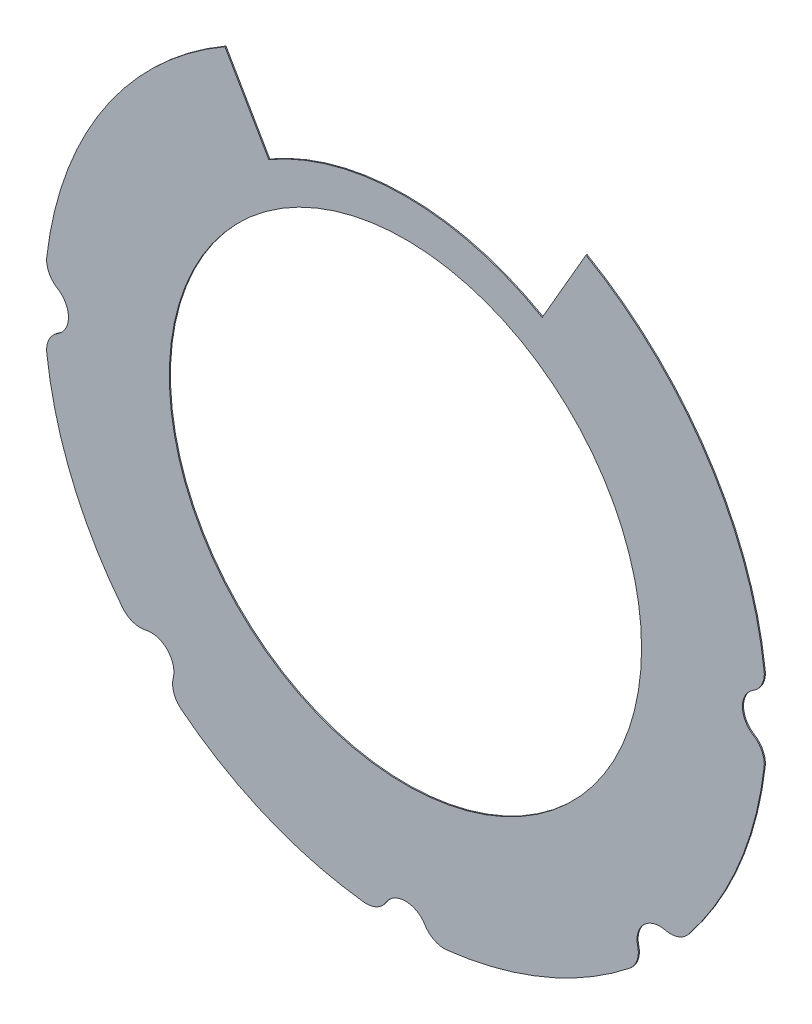
ISO-10303-21;
HEADER;
FILE_DESCRIPTION(('STEP AP214'),'2;1');
FILE_NAME('part.step','',(''),(''),'','','');
FILE_SCHEMA(('AUTOMOTIVE_DESIGN { 1 0 10303 214 1 1 1 1 }'));
ENDSEC;
DATA;
#1=APPLICATION_CONTEXT('core data for automotive mechanical design processes');
#2=APPLICATION_PROTOCOL_DEFINITION('international standard','automotive_design',2000,#1);
#3=PRODUCT_CONTEXT('',#1,'mechanical');
#4=PRODUCT('Part','Part','',(#3));
#5=PRODUCT_RELATED_PRODUCT_CATEGORY('part','',(#4));
#6=PRODUCT_DEFINITION_FORMATION('','',#4);
#7=PRODUCT_DEFINITION_CONTEXT('part definition',#1,'design');
#8=PRODUCT_DEFINITION('design','',#6,#7);
#9=PRODUCT_DEFINITION_SHAPE('','',#8);
#10=(LENGTH_UNIT() NAMED_UNIT(*) SI_UNIT(.MILLI.,.METRE.));
#11=(NAMED_UNIT(*) PLANE_ANGLE_UNIT() SI_UNIT($,.RADIAN.));
#12=(NAMED_UNIT(*) SI_UNIT($,.STERADIAN.) SOLID_ANGLE_UNIT());
#13=UNCERTAINTY_MEASURE_WITH_UNIT(LENGTH_MEASURE(1.E-05),#10,'distance_accuracy_value','');
#14=(GEOMETRIC_REPRESENTATION_CONTEXT(3) GLOBAL_UNCERTAINTY_ASSIGNED_CONTEXT((#13)) GLOBAL_UNIT_ASSIGNED_CONTEXT((#10,
#11,#12)) REPRESENTATION_CONTEXT('',''));
#15=CARTESIAN_POINT('',(0.,0.,0.));
#16=DIRECTION('',(0.,0.,1.));
#17=DIRECTION('',(1.,0.,0.));
#18=AXIS2_PLACEMENT_3D('',#15,#16,#17);
#19=CARTESIAN_POINT('',(-46.6814400000016,5.41970336147584,-15.88));
#20=DIRECTION('',(0.,0.,1.));
#21=DIRECTION('',(1.,0.,0.));
#22=AXIS2_PLACEMENT_3D('',#19,#20,#21);
#23=CYLINDRICAL_SURFACE('',#22,3.17999999998999);
#24=CARTESIAN_POINT('',(-46.6814400000016,5.41970336147584,-15.88));
#25=DIRECTION('',(0.,0.,1.));
#26=DIRECTION('',(1.,0.,0.));
#27=AXIS2_PLACEMENT_3D('',#24,#25,#26);
#28=CIRCLE('',#27,3.17999999998999);
#29=CARTESIAN_POINT('',(-49.8402224066298,5.7864371988932,-15.88));
#30=VERTEX_POINT('',#29);
#31=CARTESIAN_POINT('',(-48.3420254916252,2.70771961797535,-15.88));
#32=VERTEX_POINT('',#31);
#33=EDGE_CURVE('E20',#30,#32,#28,.T.);
#34=ORIENTED_EDGE('',*,*,#33,.T.);
#35=DIRECTION('',(0.,0.,-1.));
#36=VECTOR('',#35,1.);
#37=CARTESIAN_POINT('',(-48.3420254915091,2.70771961790426,-15.8050000000003));
#38=LINE('',#37,#36);
#39=CARTESIAN_POINT('',(-48.3420254916225,2.70771961797972,-15.7300000000006));
#40=VERTEX_POINT('',#39);
#41=EDGE_CURVE('E157',#32,#40,#38,.F.);
#42=ORIENTED_EDGE('',*,*,#41,.T.);
#43=CARTESIAN_POINT('',(-46.6814400000016,5.41970336147584,-15.7300000000006));
#44=DIRECTION('',(0.,0.,1.));
#45=DIRECTION('',(1.,0.,0.));
#46=AXIS2_PLACEMENT_3D('',#43,#44,#45);
#47=CIRCLE('',#46,3.17999999998999);
#48=CARTESIAN_POINT('',(-49.840222406629,5.7864371988931,-15.7300000000006));
#49=VERTEX_POINT('',#48);
#50=EDGE_CURVE('E284',#40,#49,#47,.F.);
#51=ORIENTED_EDGE('',*,*,#50,.T.);
#52=DIRECTION('',(0.,0.,-1.));
#53=VECTOR('',#52,1.);
#54=CARTESIAN_POINT('',(-49.840222406629,5.78643719889299,-15.8050000000003));
#55=LINE('',#54,#53);
#56=EDGE_CURVE('E166',#49,#30,#55,.T.);
#57=ORIENTED_EDGE('',*,*,#56,.T.);
#58=EDGE_LOOP('',(#34,#42,#51,#57));
#59=FACE_BOUND('',#58,.T.);
#60=ADVANCED_FACE('F16',(#59),#23,.T.);
#61=CARTESIAN_POINT('',(0.,0.,-15.88));
#62=DIRECTION('',(0.,0.,1.));
#63=DIRECTION('',(1.,0.,0.));
#64=AXIS2_PLACEMENT_3D('',#61,#62,#63);
#65=CYLINDRICAL_SURFACE('',#64,50.1749999999898);
#66=DIRECTION('',(0.,0.,1.));
#67=VECTOR('',#66,1.);
#68=CARTESIAN_POINT('',(-25.087499999991,43.452824634894,-15.8050000000003));
#69=LINE('',#68,#67);
#70=CARTESIAN_POINT('',(-25.0874999999875,43.4528246348879,-15.7300000000006));
#71=VERTEX_POINT('',#70);
#72=CARTESIAN_POINT('',(-25.0874999999875,43.4528246348879,-15.88));
#73=VERTEX_POINT('',#72);
#74=EDGE_CURVE('E214',#71,#73,#69,.F.);
#75=ORIENTED_EDGE('',*,*,#74,.T.);
#76=CARTESIAN_POINT('',(0.,0.,-15.88));
#77=DIRECTION('',(0.,0.,1.));
#78=DIRECTION('',(1.,0.,0.));
#79=AXIS2_PLACEMENT_3D('',#76,#77,#78);
#80=CIRCLE('',#79,50.1749999999898);
#81=EDGE_CURVE('E289',#73,#30,#80,.T.);
#82=ORIENTED_EDGE('',*,*,#81,.T.);
#83=ORIENTED_EDGE('',*,*,#56,.F.);
#84=CARTESIAN_POINT('',(0.,0.,-15.7300000000006));
#85=DIRECTION('',(0.,0.,1.));
#86=DIRECTION('',(1.,0.,0.));
#87=AXIS2_PLACEMENT_3D('',#84,#85,#86);
#88=CIRCLE('',#87,50.1749999999898);
#89=EDGE_CURVE('E281',#49,#71,#88,.F.);
#90=ORIENTED_EDGE('',*,*,#89,.T.);
#91=EDGE_LOOP('',(#75,#82,#83,#90));
#92=FACE_BOUND('',#91,.T.);
#93=ADVANCED_FACE('F489',(#92),#65,.T.);
#94=CARTESIAN_POINT('',(-18.8739666877646,32.6906692436006,-15.8829999999995));
#95=DIRECTION('',(0.866025403784348,0.500000000000157,0.));
#96=DIRECTION('',(-0.500000000000157,0.866025403784348,0.));
#97=AXIS2_PLACEMENT_3D('',#94,#95,#96);
#98=PLANE('',#97);
#99=DIRECTION('',(-0.500000000000157,0.866025403784348,0.));
#100=VECTOR('',#99,1.);
#101=CARTESIAN_POINT('',(-18.8739666877646,32.6906692436006,-15.7300000000006));
#102=LINE('',#101,#100);
#103=CARTESIAN_POINT('',(-18.9999999999912,32.9089653438142,-15.7300000000006));
#104=VERTEX_POINT('',#103);
#105=EDGE_CURVE('E278',#71,#104,#102,.F.);
#106=ORIENTED_EDGE('',*,*,#105,.T.);
#107=DIRECTION('',(0.,0.,-1.));
#108=VECTOR('',#107,1.);
#109=CARTESIAN_POINT('',(-18.999999999995,32.908965343812,-15.8050000000003));
#110=LINE('',#109,#108);
#111=CARTESIAN_POINT('',(-18.9999999999912,32.9089653438142,-15.88));
#112=VERTEX_POINT('',#111);
#113=EDGE_CURVE('E212',#104,#112,#110,.T.);
#114=ORIENTED_EDGE('',*,*,#113,.T.);
#115=DIRECTION('',(-0.500000000000157,0.866025403784348,0.));
#116=VECTOR('',#115,1.);
#117=CARTESIAN_POINT('',(-18.8739666877646,32.6906692436006,-15.88));
#118=LINE('',#117,#116);
#119=EDGE_CURVE('E291',#112,#73,#118,.T.);
#120=ORIENTED_EDGE('',*,*,#119,.T.);
#121=ORIENTED_EDGE('',*,*,#74,.F.);
#122=EDGE_LOOP('',(#106,#114,#120,#121));
#123=FACE_BOUND('',#122,.T.);
#124=ADVANCED_FACE('F487',(#123),#98,.T.);
#125=CARTESIAN_POINT('',(0.,0.,-15.7300000000006));
#126=DIRECTION('',(0.,0.,-1.));
#127=DIRECTION('',(-1.,0.,0.));
#128=AXIS2_PLACEMENT_3D('',#125,#126,#127);
#129=CYLINDRICAL_SURFACE('',#128,38.0000000000004);
#130=CARTESIAN_POINT('',(0.,0.,-15.7300000000006));
#131=DIRECTION('',(0.,0.,-1.));
#132=DIRECTION('',(-1.,0.,0.));
#133=AXIS2_PLACEMENT_3D('',#130,#131,#132);
#134=CIRCLE('',#133,38.0000000000004);
#135=CARTESIAN_POINT('',(19.0000000000048,32.908965343808,-15.7300000000006));
#136=VERTEX_POINT('',#135);
#137=EDGE_CURVE('E275',#104,#136,#134,.T.);
#138=ORIENTED_EDGE('',*,*,#137,.T.);
#139=DIRECTION('',(0.,0.,-1.));
#140=VECTOR('',#139,1.);
#141=CARTESIAN_POINT('',(19.0000000000055,32.9089653438092,-15.8050000000003));
#142=LINE('',#141,#140);
#143=CARTESIAN_POINT('',(19.0000000000048,32.908965343808,-15.88));
#144=VERTEX_POINT('',#143);
#145=EDGE_CURVE('E210',#136,#144,#142,.T.);
#146=ORIENTED_EDGE('',*,*,#145,.T.);
#147=CARTESIAN_POINT('',(0.,0.,-15.88));
#148=DIRECTION('',(0.,0.,-1.));
#149=DIRECTION('',(-1.,0.,0.));
#150=AXIS2_PLACEMENT_3D('',#147,#148,#149);
#151=CIRCLE('',#150,38.0000000000004);
#152=EDGE_CURVE('E294',#144,#112,#151,.F.);
#153=ORIENTED_EDGE('',*,*,#152,.T.);
#154=ORIENTED_EDGE('',*,*,#113,.F.);
#155=EDGE_LOOP('',(#138,#146,#153,#154));
#156=FACE_BOUND('',#155,.T.);
#157=ADVANCED_FACE('F484',(#156),#129,.T.);
#158=CARTESIAN_POINT('',(25.2135333122382,43.6711207351048,-15.7270000000011));
#159=DIRECTION('',(0.866025403784174,-0.500000000000458,0.));
#160=DIRECTION('',(-0.500000000000458,-0.866025403784174,0.));
#161=AXIS2_PLACEMENT_3D('',#158,#159,#160);
#162=PLANE('',#161);
#163=DIRECTION('',(-0.500000000000458,-0.866025403784174,0.));
#164=VECTOR('',#163,1.);
#165=CARTESIAN_POINT('',(25.2135333122382,43.6711207351048,-15.7300000000006));
#166=LINE('',#165,#164);
#167=CARTESIAN_POINT('',(25.0874999999958,43.4528246348749,-15.7300000000006));
#168=VERTEX_POINT('',#167);
#169=EDGE_CURVE('E272',#136,#168,#166,.F.);
#170=ORIENTED_EDGE('',*,*,#169,.T.);
#171=DIRECTION('',(0.,0.,-1.));
#172=VECTOR('',#171,1.);
#173=CARTESIAN_POINT('',(25.0874999999872,43.4528246348798,-15.8050000000003));
#174=LINE('',#173,#172);
#175=CARTESIAN_POINT('',(25.0874999999958,43.4528246348749,-15.88));
#176=VERTEX_POINT('',#175);
#177=EDGE_CURVE('E208',#168,#176,#174,.T.);
#178=ORIENTED_EDGE('',*,*,#177,.T.);
#179=DIRECTION('',(-0.500000000000458,-0.866025403784174,0.));
#180=VECTOR('',#179,1.);
#181=CARTESIAN_POINT('',(25.2135333122382,43.6711207351048,-15.88));
#182=LINE('',#181,#180);
#183=EDGE_CURVE('E297',#176,#144,#182,.T.);
#184=ORIENTED_EDGE('',*,*,#183,.T.);
#185=ORIENTED_EDGE('',*,*,#145,.F.);
#186=EDGE_LOOP('',(#170,#178,#184,#185));
#187=FACE_BOUND('',#186,.T.);
#188=ADVANCED_FACE('F482',(#187),#162,.F.);
#189=CARTESIAN_POINT('',(0.,0.,-15.88));
#190=DIRECTION('',(0.,0.,1.));
#191=DIRECTION('',(1.,0.,0.));
#192=AXIS2_PLACEMENT_3D('',#189,#190,#191);
#193=CYLINDRICAL_SURFACE('',#192,50.1749999999898);
#194=ORIENTED_EDGE('',*,*,#177,.F.);
#195=CARTESIAN_POINT('',(0.,0.,-15.7300000000006));
#196=DIRECTION('',(0.,0.,1.));
#197=DIRECTION('',(1.,0.,0.));
#198=AXIS2_PLACEMENT_3D('',#195,#196,#197);
#199=CIRCLE('',#198,50.1749999999898);
#200=CARTESIAN_POINT('',(49.8402224066305,5.78643719889455,-15.7300000000006));
#201=VERTEX_POINT('',#200);
#202=EDGE_CURVE('E269',#168,#201,#199,.F.);
#203=ORIENTED_EDGE('',*,*,#202,.T.);
#204=DIRECTION('',(0.,0.,-1.));
#205=VECTOR('',#204,1.);
#206=CARTESIAN_POINT('',(49.8402224066304,5.7864371988957,-15.8050000000003));
#207=LINE('',#206,#205);
#208=CARTESIAN_POINT('',(49.8402224066297,5.78643719889445,-15.88));
#209=VERTEX_POINT('',#208);
#210=EDGE_CURVE('E206',#201,#209,#207,.T.);
#211=ORIENTED_EDGE('',*,*,#210,.T.);
#212=CARTESIAN_POINT('',(0.,0.,-15.88));
#213=DIRECTION('',(0.,0.,1.));
#214=DIRECTION('',(1.,0.,0.));
#215=AXIS2_PLACEMENT_3D('',#212,#213,#214);
#216=CIRCLE('',#215,50.1749999999898);
#217=EDGE_CURVE('E300',#209,#176,#216,.T.);
#218=ORIENTED_EDGE('',*,*,#217,.T.);
#219=EDGE_LOOP('',(#194,#203,#211,#218));
#220=FACE_BOUND('',#219,.T.);
#221=ADVANCED_FACE('F478',(#220),#193,.T.);
#222=CARTESIAN_POINT('',(46.6814400000016,5.41970336147584,-15.7300000000006));
#223=DIRECTION('',(0.,0.,-1.));
#224=DIRECTION('',(-1.,0.,0.));
#225=AXIS2_PLACEMENT_3D('',#222,#223,#224);
#226=CYLINDRICAL_SURFACE('',#225,3.17999999998999);
#227=CARTESIAN_POINT('',(46.6814400000016,5.41970336147584,-15.7300000000006));
#228=DIRECTION('',(0.,0.,-1.));
#229=DIRECTION('',(-1.,0.,0.));
#230=AXIS2_PLACEMENT_3D('',#227,#228,#229);
#231=CIRCLE('',#230,3.17999999998999);
#232=CARTESIAN_POINT('',(48.3420254916367,2.70771961798239,-15.7300000000006));
#233=VERTEX_POINT('',#232);
#234=EDGE_CURVE('E266',#201,#233,#231,.T.);
#235=ORIENTED_EDGE('',*,*,#234,.T.);
#236=DIRECTION('',(0.,0.,1.));
#237=VECTOR('',#236,1.);
#238=CARTESIAN_POINT('',(48.3420254915321,2.70771961791835,-15.8050000000003));
#239=LINE('',#238,#237);
#240=CARTESIAN_POINT('',(48.342025491634,2.70771961798677,-15.88));
#241=VERTEX_POINT('',#240);
#242=EDGE_CURVE('E204',#233,#241,#239,.F.);
#243=ORIENTED_EDGE('',*,*,#242,.T.);
#244=CARTESIAN_POINT('',(46.6814400000016,5.41970336147584,-15.88));
#245=DIRECTION('',(0.,0.,-1.));
#246=DIRECTION('',(-1.,0.,0.));
#247=AXIS2_PLACEMENT_3D('',#244,#245,#246);
#248=CIRCLE('',#247,3.17999999998999);
#249=EDGE_CURVE('E303',#241,#209,#248,.F.);
#250=ORIENTED_EDGE('',*,*,#249,.T.);
#251=ORIENTED_EDGE('',*,*,#210,.F.);
#252=EDGE_LOOP('',(#235,#243,#250,#251));
#253=FACE_BOUND('',#252,.T.);
#254=ADVANCED_FACE('F474',(#253),#226,.T.);
#255=CARTESIAN_POINT('',(50.0000000000032,0.,-15.7300000000006));
#256=DIRECTION('',(0.,0.,-1.));
#257=DIRECTION('',(-1.,0.,0.));
#258=AXIS2_PLACEMENT_3D('',#255,#256,#257);
#259=CYLINDRICAL_SURFACE('',#258,3.175);
#260=CARTESIAN_POINT('',(50.0000000000032,0.,-15.88));
#261=DIRECTION('',(0.,0.,-1.));
#262=DIRECTION('',(-1.,0.,0.));
#263=AXIS2_PLACEMENT_3D('',#260,#261,#262);
#264=CIRCLE('',#263,3.175);
#265=CARTESIAN_POINT('',(48.3420254916494,-2.70771961799623,-15.88));
#266=VERTEX_POINT('',#265);
#267=EDGE_CURVE('E306',#266,#241,#264,.T.);
#268=ORIENTED_EDGE('',*,*,#267,.T.);
#269=ORIENTED_EDGE('',*,*,#242,.F.);
#270=CARTESIAN_POINT('',(50.0000000000032,0.,-15.7300000000006));
#271=DIRECTION('',(0.,0.,-1.));
#272=DIRECTION('',(-1.,0.,0.));
#273=AXIS2_PLACEMENT_3D('',#270,#271,#272);
#274=CIRCLE('',#273,3.175);
#275=CARTESIAN_POINT('',(48.3420254916468,-2.7077196180006,-15.7300000000006));
#276=VERTEX_POINT('',#275);
#277=EDGE_CURVE('E263',#233,#276,#274,.F.);
#278=ORIENTED_EDGE('',*,*,#277,.T.);
#279=DIRECTION('',(0.,0.,-1.));
#280=VECTOR('',#279,1.);
#281=CARTESIAN_POINT('',(48.3420254915576,-2.70771961794602,-15.8050000000003));
#282=LINE('',#281,#280);
#283=EDGE_CURVE('E200',#276,#266,#282,.T.);
#284=ORIENTED_EDGE('',*,*,#283,.T.);
#285=EDGE_LOOP('',(#268,#269,#278,#284));
#286=FACE_BOUND('',#285,.T.);
#287=ADVANCED_FACE('F470',(#286),#259,.F.);
#288=CARTESIAN_POINT('',(46.6814400000016,-5.41970336147584,-15.88));
#289=DIRECTION('',(0.,0.,1.));
#290=DIRECTION('',(1.,0.,0.));
#291=AXIS2_PLACEMENT_3D('',#288,#289,#290);
#292=CYLINDRICAL_SURFACE('',#291,3.17999999998999);
#293=CARTESIAN_POINT('',(46.6814400000016,-5.41970336147584,-15.88));
#294=DIRECTION('',(0.,0.,1.));
#295=DIRECTION('',(1.,0.,0.));
#296=AXIS2_PLACEMENT_3D('',#293,#294,#295);
#297=CIRCLE('',#296,3.17999999998999);
#298=CARTESIAN_POINT('',(49.8402224066298,-5.7864371988932,-15.88));
#299=VERTEX_POINT('',#298);
#300=EDGE_CURVE('E309',#299,#266,#297,.T.);
#301=ORIENTED_EDGE('',*,*,#300,.T.);
#302=ORIENTED_EDGE('',*,*,#283,.F.);
#303=CARTESIAN_POINT('',(46.6814400000016,-5.41970336147584,-15.7300000000006));
#304=DIRECTION('',(0.,0.,1.));
#305=DIRECTION('',(1.,0.,0.));
#306=AXIS2_PLACEMENT_3D('',#303,#304,#305);
#307=CIRCLE('',#306,3.17999999998999);
#308=CARTESIAN_POINT('',(49.840222406629,-5.7864371988931,-15.7300000000006));
#309=VERTEX_POINT('',#308);
#310=EDGE_CURVE('E260',#276,#309,#307,.F.);
#311=ORIENTED_EDGE('',*,*,#310,.T.);
#312=DIRECTION('',(0.,0.,-1.));
#313=VECTOR('',#312,1.);
#314=CARTESIAN_POINT('',(49.840222406629,-5.786437198893,-15.8050000000003));
#315=LINE('',#314,#313);
#316=EDGE_CURVE('E198',#309,#299,#315,.T.);
#317=ORIENTED_EDGE('',*,*,#316,.T.);
#318=EDGE_LOOP('',(#301,#302,#311,#317));
#319=FACE_BOUND('',#318,.T.);
#320=ADVANCED_FACE('F466',(#319),#292,.T.);
#321=CARTESIAN_POINT('',(0.,0.,-15.88));
#322=DIRECTION('',(0.,0.,1.));
#323=DIRECTION('',(1.,0.,0.));
#324=AXIS2_PLACEMENT_3D('',#321,#322,#323);
#325=CYLINDRICAL_SURFACE('',#324,50.1749999999898);
#326=ORIENTED_EDGE('',*,*,#316,.F.);
#327=CARTESIAN_POINT('',(0.,0.,-15.7300000000006));
#328=DIRECTION('',(0.,0.,1.));
#329=DIRECTION('',(1.,0.,0.));
#330=AXIS2_PLACEMENT_3D('',#327,#328,#329);
#331=CIRCLE('',#330,50.1749999999898);
#332=CARTESIAN_POINT('',(39.3339882218073,-31.1507302573423,-15.7300000000006));
#333=VERTEX_POINT('',#332);
#334=EDGE_CURVE('E258',#309,#333,#331,.F.);
#335=ORIENTED_EDGE('',*,*,#334,.T.);
#336=DIRECTION('',(0.,0.,1.));
#337=VECTOR('',#336,1.);
#338=CARTESIAN_POINT('',(39.3339882217948,-31.1507302573581,-15.8050000000003));
#339=LINE('',#338,#337);
#340=CARTESIAN_POINT('',(39.3339882218073,-31.1507302573423,-15.88));
#341=VERTEX_POINT('',#340);
#342=EDGE_CURVE('E35',#341,#333,#339,.T.);
#343=ORIENTED_EDGE('',*,*,#342,.F.);
#344=CARTESIAN_POINT('',(0.,0.,-15.88));
#345=DIRECTION('',(0.,0.,1.));
#346=DIRECTION('',(1.,0.,0.));
#347=AXIS2_PLACEMENT_3D('',#344,#345,#346);
#348=CIRCLE('',#347,50.1749999999898);
#349=EDGE_CURVE('E312',#341,#299,#348,.T.);
#350=ORIENTED_EDGE('',*,*,#349,.T.);
#351=EDGE_LOOP('',(#326,#335,#343,#350));
#352=FACE_BOUND('',#351,.T.);
#353=ADVANCED_FACE('F463',(#352),#325,.T.);
#354=CARTESIAN_POINT('',(35.3553390593354,-35.3553390593354,-15.7300000000006));
#355=DIRECTION('',(0.,0.,-1.));
#356=DIRECTION('',(-1.,0.,0.));
#357=AXIS2_PLACEMENT_3D('',#354,#355,#356);
#358=CYLINDRICAL_SURFACE('',#357,3.17500000002449);
#359=CARTESIAN_POINT('',(35.3553390593354,-35.3553390593354,-15.88));
#360=DIRECTION('',(0.,0.,-1.));
#361=DIRECTION('',(-1.,0.,0.));
#362=AXIS2_PLACEMENT_3D('',#359,#360,#361);
#363=CIRCLE('',#362,3.17500000002449);
#364=CARTESIAN_POINT('',(32.2683271381226,-36.09762094537,-15.88));
#365=VERTEX_POINT('',#364);
#366=CARTESIAN_POINT('',(36.0976209453741,-32.2683271381057,-15.88));
#367=VERTEX_POINT('',#366);
#368=EDGE_CURVE('E315',#365,#367,#363,.T.);
#369=ORIENTED_EDGE('',*,*,#368,.T.);
#370=DIRECTION('',(0.,0.,1.));
#371=VECTOR('',#370,1.);
#372=CARTESIAN_POINT('',(36.0976209457682,-32.2683271382004,-15.8050000000003));
#373=LINE('',#372,#371);
#374=CARTESIAN_POINT('',(36.0976209453741,-32.2683271381057,-15.7300000000006));
#375=VERTEX_POINT('',#374);
#376=EDGE_CURVE('E196',#375,#367,#373,.F.);
#377=ORIENTED_EDGE('',*,*,#376,.F.);
#378=CARTESIAN_POINT('',(35.3553390593354,-35.3553390593354,-15.7300000000006));
#379=DIRECTION('',(0.,0.,-1.));
#380=DIRECTION('',(-1.,0.,0.));
#381=AXIS2_PLACEMENT_3D('',#378,#379,#380);
#382=CIRCLE('',#381,3.17500000002449);
#383=CARTESIAN_POINT('',(32.2683271381396,-36.0976209453659,-15.7300000000006));
#384=VERTEX_POINT('',#383);
#385=EDGE_CURVE('E255',#375,#384,#382,.F.);
#386=ORIENTED_EDGE('',*,*,#385,.T.);
#387=DIRECTION('',(0.,0.,-1.));
#388=VECTOR('',#387,1.);
#389=CARTESIAN_POINT('',(32.2683271382343,-36.0976209457601,-15.8050000000003));
#390=LINE('',#389,#388);
#391=EDGE_CURVE('E193',#384,#365,#390,.T.);
#392=ORIENTED_EDGE('',*,*,#391,.T.);
#393=EDGE_LOOP('',(#369,#377,#386,#392));
#394=FACE_BOUND('',#393,.T.);
#395=ADVANCED_FACE('F422',(#394),#358,.F.);
#396=CARTESIAN_POINT('',(29.1764537806308,-36.841071778466,-15.88));
#397=DIRECTION('',(0.,0.,1.));
#398=DIRECTION('',(1.,0.,0.));
#399=AXIS2_PLACEMENT_3D('',#396,#397,#398);
#400=CYLINDRICAL_SURFACE('',#399,3.18000000001726);
#401=CARTESIAN_POINT('',(29.1764537806308,-36.841071778466,-15.88));
#402=DIRECTION('',(0.,0.,1.));
#403=DIRECTION('',(1.,0.,0.));
#404=AXIS2_PLACEMENT_3D('',#401,#402,#403);
#405=CIRCLE('',#404,3.18000000001726);
#406=CARTESIAN_POINT('',(31.1507302573488,-39.3339882218154,-15.88));
#407=VERTEX_POINT('',#406);
#408=EDGE_CURVE('E318',#407,#365,#405,.T.);
#409=ORIENTED_EDGE('',*,*,#408,.T.);
#410=ORIENTED_EDGE('',*,*,#391,.F.);
#411=CARTESIAN_POINT('',(29.1764537806308,-36.841071778466,-15.7300000000006));
#412=DIRECTION('',(0.,0.,1.));
#413=DIRECTION('',(1.,0.,0.));
#414=AXIS2_PLACEMENT_3D('',#411,#412,#413);
#415=CIRCLE('',#414,3.18000000001726);
#416=CARTESIAN_POINT('',(31.1507302573423,-39.3339882218073,-15.7300000000006));
#417=VERTEX_POINT('',#416);
#418=EDGE_CURVE('E252',#384,#417,#415,.F.);
#419=ORIENTED_EDGE('',*,*,#418,.T.);
#420=DIRECTION('',(0.,0.,-1.));
#421=VECTOR('',#420,1.);
#422=CARTESIAN_POINT('',(31.1507302573581,-39.3339882217948,-15.8050000000003));
#423=LINE('',#422,#421);
#424=EDGE_CURVE('E191',#417,#407,#423,.T.);
#425=ORIENTED_EDGE('',*,*,#424,.T.);
#426=EDGE_LOOP('',(#409,#410,#419,#425));
#427=FACE_BOUND('',#426,.T.);
#428=ADVANCED_FACE('F417',(#427),#400,.T.);
#429=CARTESIAN_POINT('',(0.,0.,-15.88));
#430=DIRECTION('',(0.,0.,1.));
#431=DIRECTION('',(1.,0.,0.));
#432=AXIS2_PLACEMENT_3D('',#429,#430,#431);
#433=CYLINDRICAL_SURFACE('',#432,50.1749999999898);
#434=ORIENTED_EDGE('',*,*,#424,.F.);
#435=CARTESIAN_POINT('',(0.,0.,-15.7300000000006));
#436=DIRECTION('',(0.,0.,1.));
#437=DIRECTION('',(1.,0.,0.));
#438=AXIS2_PLACEMENT_3D('',#435,#436,#437);
#439=CIRCLE('',#438,50.1749999999898);
#440=CARTESIAN_POINT('',(5.78643719889455,-49.8402224066305,-15.7300000000006));
#441=VERTEX_POINT('',#440);
#442=EDGE_CURVE('E249',#417,#441,#439,.F.);
#443=ORIENTED_EDGE('',*,*,#442,.T.);
#444=DIRECTION('',(0.,0.,-1.));
#445=VECTOR('',#444,1.);
#446=CARTESIAN_POINT('',(5.7864371988957,-49.8402224066304,-15.8050000000003));
#447=LINE('',#446,#445);
#448=CARTESIAN_POINT('',(5.78643719889445,-49.8402224066297,-15.88));
#449=VERTEX_POINT('',#448);
#450=EDGE_CURVE('E189',#441,#449,#447,.T.);
#451=ORIENTED_EDGE('',*,*,#450,.T.);
#452=CARTESIAN_POINT('',(0.,0.,-15.88));
#453=DIRECTION('',(0.,0.,1.));
#454=DIRECTION('',(1.,0.,0.));
#455=AXIS2_PLACEMENT_3D('',#452,#453,#454);
#456=CIRCLE('',#455,50.1749999999898);
#457=EDGE_CURVE('E321',#449,#407,#456,.T.);
#458=ORIENTED_EDGE('',*,*,#457,.T.);
#459=EDGE_LOOP('',(#434,#443,#451,#458));
#460=FACE_BOUND('',#459,.T.);
#461=ADVANCED_FACE('F412',(#460),#433,.T.);
#462=CARTESIAN_POINT('',(5.41970336147584,-46.6814400000016,-15.7300000000006));
#463=DIRECTION('',(0.,0.,-1.));
#464=DIRECTION('',(-1.,0.,0.));
#465=AXIS2_PLACEMENT_3D('',#462,#463,#464);
#466=CYLINDRICAL_SURFACE('',#465,3.17999999998999);
#467=CARTESIAN_POINT('',(5.41970336147584,-46.6814400000016,-15.7300000000006));
#468=DIRECTION('',(0.,0.,-1.));
#469=DIRECTION('',(-1.,0.,0.));
#470=AXIS2_PLACEMENT_3D('',#467,#468,#469);
#471=CIRCLE('',#470,3.17999999998999);
#472=CARTESIAN_POINT('',(2.70771961798239,-48.3420254916367,-15.7300000000006));
#473=VERTEX_POINT('',#472);
#474=EDGE_CURVE('E246',#441,#473,#471,.T.);
#475=ORIENTED_EDGE('',*,*,#474,.T.);
#476=DIRECTION('',(0.,0.,1.));
#477=VECTOR('',#476,1.);
#478=CARTESIAN_POINT('',(2.70771961791835,-48.3420254915321,-15.8050000000003));
#479=LINE('',#478,#477);
#480=CARTESIAN_POINT('',(2.70771961798677,-48.342025491634,-15.88));
#481=VERTEX_POINT('',#480);
#482=EDGE_CURVE('E187',#473,#481,#479,.F.);
#483=ORIENTED_EDGE('',*,*,#482,.T.);
#484=CARTESIAN_POINT('',(5.41970336147584,-46.6814400000016,-15.88));
#485=DIRECTION('',(0.,0.,-1.));
#486=DIRECTION('',(-1.,0.,0.));
#487=AXIS2_PLACEMENT_3D('',#484,#485,#486);
#488=CIRCLE('',#487,3.17999999998999);
#489=EDGE_CURVE('E324',#481,#449,#488,.F.);
#490=ORIENTED_EDGE('',*,*,#489,.T.);
#491=ORIENTED_EDGE('',*,*,#450,.F.);
#492=EDGE_LOOP('',(#475,#483,#490,#491));
#493=FACE_BOUND('',#492,.T.);
#494=ADVANCED_FACE('F405',(#493),#466,.T.);
#495=CARTESIAN_POINT('',(0.,-50.0000000000032,-15.7300000000006));
#496=DIRECTION('',(0.,0.,-1.));
#497=DIRECTION('',(-1.,0.,0.));
#498=AXIS2_PLACEMENT_3D('',#495,#496,#497);
#499=CYLINDRICAL_SURFACE('',#498,3.175);
#500=CARTESIAN_POINT('',(0.,-50.0000000000032,-15.88));
#501=DIRECTION('',(0.,0.,-1.));
#502=DIRECTION('',(-1.,0.,0.));
#503=AXIS2_PLACEMENT_3D('',#500,#501,#502);
#504=CIRCLE('',#503,3.175);
#505=CARTESIAN_POINT('',(-2.70771961799623,-48.3420254916494,-15.88));
#506=VERTEX_POINT('',#505);
#507=EDGE_CURVE('E327',#506,#481,#504,.T.);
#508=ORIENTED_EDGE('',*,*,#507,.T.);
#509=ORIENTED_EDGE('',*,*,#482,.F.);
#510=CARTESIAN_POINT('',(0.,-50.0000000000032,-15.7300000000006));
#511=DIRECTION('',(0.,0.,-1.));
#512=DIRECTION('',(-1.,0.,0.));
#513=AXIS2_PLACEMENT_3D('',#510,#511,#512);
#514=CIRCLE('',#513,3.175);
#515=CARTESIAN_POINT('',(-2.7077196180006,-48.3420254916468,-15.7300000000006));
#516=VERTEX_POINT('',#515);
#517=EDGE_CURVE('E243',#473,#516,#514,.F.);
#518=ORIENTED_EDGE('',*,*,#517,.T.);
#519=DIRECTION('',(0.,0.,-1.));
#520=VECTOR('',#519,1.);
#521=CARTESIAN_POINT('',(-2.70771961794602,-48.3420254915576,-15.8050000000003));
#522=LINE('',#521,#520);
#523=EDGE_CURVE('E184',#516,#506,#522,.T.);
#524=ORIENTED_EDGE('',*,*,#523,.T.);
#525=EDGE_LOOP('',(#508,#509,#518,#524));
#526=FACE_BOUND('',#525,.T.);
#527=ADVANCED_FACE('F400',(#526),#499,.F.);
#528=CARTESIAN_POINT('',(-5.41970336147584,-46.6814400000016,-15.88));
#529=DIRECTION('',(0.,0.,1.));
#530=DIRECTION('',(1.,0.,0.));
#531=AXIS2_PLACEMENT_3D('',#528,#529,#530);
#532=CYLINDRICAL_SURFACE('',#531,3.17999999998999);
#533=CARTESIAN_POINT('',(-5.41970336147584,-46.6814400000016,-15.88));
#534=DIRECTION('',(0.,0.,1.));
#535=DIRECTION('',(1.,0.,0.));
#536=AXIS2_PLACEMENT_3D('',#533,#534,#535);
#537=CIRCLE('',#536,3.17999999998999);
#538=CARTESIAN_POINT('',(-5.78643719889195,-49.84022240663,-15.88));
#539=VERTEX_POINT('',#538);
#540=EDGE_CURVE('E330',#539,#506,#537,.T.);
#541=ORIENTED_EDGE('',*,*,#540,.T.);
#542=ORIENTED_EDGE('',*,*,#523,.F.);
#543=CARTESIAN_POINT('',(-5.41970336147584,-46.6814400000016,-15.7300000000006));
#544=DIRECTION('',(0.,0.,1.));
#545=DIRECTION('',(1.,0.,0.));
#546=AXIS2_PLACEMENT_3D('',#543,#544,#545);
#547=CIRCLE('',#546,3.17999999998999);
#548=CARTESIAN_POINT('',(-5.78643719889185,-49.8402224066291,-15.7300000000006));
#549=VERTEX_POINT('',#548);
#550=EDGE_CURVE('E240',#516,#549,#547,.F.);
#551=ORIENTED_EDGE('',*,*,#550,.T.);
#552=DIRECTION('',(0.,0.,-1.));
#553=VECTOR('',#552,1.);
#554=CARTESIAN_POINT('',(-5.7864371988905,-49.8402224066293,-15.8050000000003));
#555=LINE('',#554,#553);
#556=EDGE_CURVE('E182',#549,#539,#555,.T.);
#557=ORIENTED_EDGE('',*,*,#556,.T.);
#558=EDGE_LOOP('',(#541,#542,#551,#557));
#559=FACE_BOUND('',#558,.T.);
#560=ADVANCED_FACE('F390',(#559),#532,.T.);
#561=CARTESIAN_POINT('',(0.,0.,-15.88));
#562=DIRECTION('',(0.,0.,1.));
#563=DIRECTION('',(1.,0.,0.));
#564=AXIS2_PLACEMENT_3D('',#561,#562,#563);
#565=CYLINDRICAL_SURFACE('',#564,50.1749999999898);
#566=ORIENTED_EDGE('',*,*,#556,.F.);
#567=CARTESIAN_POINT('',(0.,0.,-15.7300000000006));
#568=DIRECTION('',(0.,0.,1.));
#569=DIRECTION('',(1.,0.,0.));
#570=AXIS2_PLACEMENT_3D('',#567,#568,#569);
#571=CIRCLE('',#570,50.1749999999898);
#572=CARTESIAN_POINT('',(-31.1507302573412,-39.3339882218346,-15.7300000000006));
#573=VERTEX_POINT('',#572);
#574=EDGE_CURVE('E237',#549,#573,#571,.F.);
#575=ORIENTED_EDGE('',*,*,#574,.T.);
#576=DIRECTION('',(0.,0.,-1.));
#577=VECTOR('',#576,1.);
#578=CARTESIAN_POINT('',(-31.150730257343,-39.3339882218332,-15.8050000000003));
#579=LINE('',#578,#577);
#580=CARTESIAN_POINT('',(-31.1507302573348,-39.3339882218265,-15.88));
#581=VERTEX_POINT('',#580);
#582=EDGE_CURVE('E180',#573,#581,#579,.T.);
#583=ORIENTED_EDGE('',*,*,#582,.T.);
#584=CARTESIAN_POINT('',(0.,0.,-15.88));
#585=DIRECTION('',(0.,0.,1.));
#586=DIRECTION('',(1.,0.,0.));
#587=AXIS2_PLACEMENT_3D('',#584,#585,#586);
#588=CIRCLE('',#587,50.1749999999898);
#589=EDGE_CURVE('E333',#581,#539,#588,.T.);
#590=ORIENTED_EDGE('',*,*,#589,.T.);
#591=EDGE_LOOP('',(#566,#575,#583,#590));
#592=FACE_BOUND('',#591,.T.);
#593=ADVANCED_FACE('F385',(#592),#565,.T.);
#594=CARTESIAN_POINT('',(-29.1764537806308,-36.841071778466,-15.7300000000006));
#595=DIRECTION('',(0.,0.,-1.));
#596=DIRECTION('',(-1.,0.,0.));
#597=AXIS2_PLACEMENT_3D('',#594,#595,#596);
#598=CYLINDRICAL_SURFACE('',#597,3.18000000001725);
#599=CARTESIAN_POINT('',(-29.1764537806308,-36.841071778466,-15.7300000000006));
#600=DIRECTION('',(0.,0.,-1.));
#601=DIRECTION('',(-1.,0.,0.));
#602=AXIS2_PLACEMENT_3D('',#599,#600,#601);
#603=CIRCLE('',#602,3.18000000001725);
#604=CARTESIAN_POINT('',(-32.2683271381057,-36.0976209453741,-15.7300000000006));
#605=VERTEX_POINT('',#604);
#606=EDGE_CURVE('E234',#573,#605,#603,.T.);
#607=ORIENTED_EDGE('',*,*,#606,.T.);
#608=DIRECTION('',(0.,0.,1.));
#609=VECTOR('',#608,1.);
#610=CARTESIAN_POINT('',(-32.2683271382004,-36.0976209457682,-15.8050000000003));
#611=LINE('',#610,#609);
#612=CARTESIAN_POINT('',(-32.2683271381226,-36.09762094537,-15.88));
#613=VERTEX_POINT('',#612);
#614=EDGE_CURVE('E178',#605,#613,#611,.F.);
#615=ORIENTED_EDGE('',*,*,#614,.T.);
#616=CARTESIAN_POINT('',(-29.1764537806308,-36.841071778466,-15.88));
#617=DIRECTION('',(0.,0.,-1.));
#618=DIRECTION('',(-1.,0.,0.));
#619=AXIS2_PLACEMENT_3D('',#616,#617,#618);
#620=CIRCLE('',#619,3.18000000001725);
#621=EDGE_CURVE('E336',#613,#581,#620,.F.);
#622=ORIENTED_EDGE('',*,*,#621,.T.);
#623=ORIENTED_EDGE('',*,*,#582,.F.);
#624=EDGE_LOOP('',(#607,#615,#622,#623));
#625=FACE_BOUND('',#624,.T.);
#626=ADVANCED_FACE('F380',(#625),#598,.T.);
#627=CARTESIAN_POINT('',(-35.3553390593354,-35.3553390593354,-15.7300000000006));
#628=DIRECTION('',(0.,0.,-1.));
#629=DIRECTION('',(-1.,0.,0.));
#630=AXIS2_PLACEMENT_3D('',#627,#628,#629);
#631=CYLINDRICAL_SURFACE('',#630,3.17500000002449);
#632=CARTESIAN_POINT('',(-35.3553390593354,-35.3553390593354,-15.88));
#633=DIRECTION('',(0.,0.,-1.));
#634=DIRECTION('',(-1.,0.,0.));
#635=AXIS2_PLACEMENT_3D('',#632,#633,#634);
#636=CIRCLE('',#635,3.17500000002449);
#637=CARTESIAN_POINT('',(-36.09762094537,-32.2683271381226,-15.88));
#638=VERTEX_POINT('',#637);
#639=EDGE_CURVE('E339',#638,#613,#636,.T.);
#640=ORIENTED_EDGE('',*,*,#639,.T.);
#641=ORIENTED_EDGE('',*,*,#614,.F.);
#642=CARTESIAN_POINT('',(-35.3553390593354,-35.3553390593354,-15.7300000000006));
#643=DIRECTION('',(0.,0.,-1.));
#644=DIRECTION('',(-1.,0.,0.));
#645=AXIS2_PLACEMENT_3D('',#642,#643,#644);
#646=CIRCLE('',#645,3.17500000002449);
#647=CARTESIAN_POINT('',(-36.0976209453659,-32.2683271381396,-15.7300000000006));
#648=VERTEX_POINT('',#647);
#649=EDGE_CURVE('E231',#605,#648,#646,.F.);
#650=ORIENTED_EDGE('',*,*,#649,.T.);
#651=DIRECTION('',(0.,0.,-1.));
#652=VECTOR('',#651,1.);
#653=CARTESIAN_POINT('',(-36.0976209457601,-32.2683271382343,-15.8050000000003));
#654=LINE('',#653,#652);
#655=EDGE_CURVE('E175',#648,#638,#654,.T.);
#656=ORIENTED_EDGE('',*,*,#655,.T.);
#657=EDGE_LOOP('',(#640,#641,#650,#656));
#658=FACE_BOUND('',#657,.T.);
#659=ADVANCED_FACE('F370',(#658),#631,.F.);
#660=CARTESIAN_POINT('',(-36.841071778466,-29.1764537806308,-15.88));
#661=DIRECTION('',(0.,0.,1.));
#662=DIRECTION('',(1.,0.,0.));
#663=AXIS2_PLACEMENT_3D('',#660,#661,#662);
#664=CYLINDRICAL_SURFACE('',#663,3.18000000001726);
#665=CARTESIAN_POINT('',(-36.841071778466,-29.1764537806308,-15.88));
#666=DIRECTION('',(0.,0.,1.));
#667=DIRECTION('',(1.,0.,0.));
#668=AXIS2_PLACEMENT_3D('',#665,#666,#667);
#669=CIRCLE('',#668,3.18000000001726);
#670=CARTESIAN_POINT('',(-39.3339882218154,-31.1507302573488,-15.88));
#671=VERTEX_POINT('',#670);
#672=EDGE_CURVE('E342',#671,#638,#669,.T.);
#673=ORIENTED_EDGE('',*,*,#672,.T.);
#674=ORIENTED_EDGE('',*,*,#655,.F.);
#675=CARTESIAN_POINT('',(-36.841071778466,-29.1764537806308,-15.7300000000006));
#676=DIRECTION('',(0.,0.,1.));
#677=DIRECTION('',(1.,0.,0.));
#678=AXIS2_PLACEMENT_3D('',#675,#676,#677);
#679=CIRCLE('',#678,3.18000000001726);
#680=CARTESIAN_POINT('',(-39.3339882218073,-31.1507302573423,-15.7300000000006));
#681=VERTEX_POINT('',#680);
#682=EDGE_CURVE('E228',#648,#681,#679,.F.);
#683=ORIENTED_EDGE('',*,*,#682,.T.);
#684=DIRECTION('',(0.,0.,-1.));
#685=VECTOR('',#684,1.);
#686=CARTESIAN_POINT('',(-39.3339882217948,-31.1507302573581,-15.8050000000003));
#687=LINE('',#686,#685);
#688=EDGE_CURVE('E173',#681,#671,#687,.T.);
#689=ORIENTED_EDGE('',*,*,#688,.T.);
#690=EDGE_LOOP('',(#673,#674,#683,#689));
#691=FACE_BOUND('',#690,.T.);
#692=ADVANCED_FACE('F364',(#691),#664,.T.);
#693=CARTESIAN_POINT('',(0.,0.,-15.88));
#694=DIRECTION('',(0.,0.,1.));
#695=DIRECTION('',(1.,0.,0.));
#696=AXIS2_PLACEMENT_3D('',#693,#694,#695);
#697=CYLINDRICAL_SURFACE('',#696,50.1749999999898);
#698=ORIENTED_EDGE('',*,*,#688,.F.);
#699=CARTESIAN_POINT('',(0.,0.,-15.7300000000006));
#700=DIRECTION('',(0.,0.,1.));
#701=DIRECTION('',(1.,0.,0.));
#702=AXIS2_PLACEMENT_3D('',#699,#700,#701);
#703=CIRCLE('',#702,50.1749999999898);
#704=CARTESIAN_POINT('',(-49.8402224066305,-5.78643719889455,-15.7300000000006));
#705=VERTEX_POINT('',#704);
#706=EDGE_CURVE('E225',#681,#705,#703,.F.);
#707=ORIENTED_EDGE('',*,*,#706,.T.);
#708=DIRECTION('',(0.,0.,-1.));
#709=VECTOR('',#708,1.);
#710=CARTESIAN_POINT('',(-49.8402224066304,-5.7864371988957,-15.8050000000003));
#711=LINE('',#710,#709);
#712=CARTESIAN_POINT('',(-49.8402224066297,-5.78643719889445,-15.88));
#713=VERTEX_POINT('',#712);
#714=EDGE_CURVE('E164',#705,#713,#711,.T.);
#715=ORIENTED_EDGE('',*,*,#714,.T.);
#716=CARTESIAN_POINT('',(0.,0.,-15.88));
#717=DIRECTION('',(0.,0.,1.));
#718=DIRECTION('',(1.,0.,0.));
#719=AXIS2_PLACEMENT_3D('',#716,#717,#718);
#720=CIRCLE('',#719,50.1749999999898);
#721=EDGE_CURVE('E345',#713,#671,#720,.T.);
#722=ORIENTED_EDGE('',*,*,#721,.T.);
#723=EDGE_LOOP('',(#698,#707,#715,#722));
#724=FACE_BOUND('',#723,.T.);
#725=ADVANCED_FACE('F359',(#724),#697,.T.);
#726=CARTESIAN_POINT('',(-46.6814400000016,-5.41970336147584,-15.7300000000006));
#727=DIRECTION('',(0.,0.,-1.));
#728=DIRECTION('',(-1.,0.,0.));
#729=AXIS2_PLACEMENT_3D('',#726,#727,#728);
#730=CYLINDRICAL_SURFACE('',#729,3.17999999998999);
#731=CARTESIAN_POINT('',(-46.6814400000016,-5.41970336147584,-15.7300000000006));
#732=DIRECTION('',(0.,0.,-1.));
#733=DIRECTION('',(-1.,0.,0.));
#734=AXIS2_PLACEMENT_3D('',#731,#732,#733);
#735=CIRCLE('',#734,3.17999999998999);
#736=CARTESIAN_POINT('',(-48.3420254916367,-2.70771961798239,-15.7300000000006));
#737=VERTEX_POINT('',#736);
#738=EDGE_CURVE('E223',#705,#737,#735,.T.);
#739=ORIENTED_EDGE('',*,*,#738,.T.);
#740=DIRECTION('',(0.,0.,1.));
#741=VECTOR('',#740,1.);
#742=CARTESIAN_POINT('',(-48.3420254915321,-2.70771961791835,-15.8050000000003));
#743=LINE('',#742,#741);
#744=CARTESIAN_POINT('',(-48.342025491634,-2.70771961798677,-15.88));
#745=VERTEX_POINT('',#744);
#746=EDGE_CURVE('E163',#737,#745,#743,.F.);
#747=ORIENTED_EDGE('',*,*,#746,.T.);
#748=CARTESIAN_POINT('',(-46.6814400000016,-5.41970336147584,-15.88));
#749=DIRECTION('',(0.,0.,-1.));
#750=DIRECTION('',(-1.,0.,0.));
#751=AXIS2_PLACEMENT_3D('',#748,#749,#750);
#752=CIRCLE('',#751,3.17999999998999);
#753=EDGE_CURVE('E152',#745,#713,#752,.F.);
#754=ORIENTED_EDGE('',*,*,#753,.T.);
#755=ORIENTED_EDGE('',*,*,#714,.F.);
#756=EDGE_LOOP('',(#739,#747,#754,#755));
#757=FACE_BOUND('',#756,.T.);
#758=ADVANCED_FACE('F349',(#757),#730,.T.);
#759=CARTESIAN_POINT('',(-50.0000000000032,0.,-15.7300000000006));
#760=DIRECTION('',(0.,0.,-1.));
#761=DIRECTION('',(-1.,0.,0.));
#762=AXIS2_PLACEMENT_3D('',#759,#760,#761);
#763=CYLINDRICAL_SURFACE('',#762,3.175);
#764=CARTESIAN_POINT('',(-50.0000000000032,0.,-15.88));
#765=DIRECTION('',(0.,0.,-1.));
#766=DIRECTION('',(-1.,0.,0.));
#767=AXIS2_PLACEMENT_3D('',#764,#765,#766);
#768=CIRCLE('',#767,3.175);
#769=EDGE_CURVE('E146',#32,#745,#768,.T.);
#770=ORIENTED_EDGE('',*,*,#769,.T.);
#771=ORIENTED_EDGE('',*,*,#746,.F.);
#772=CARTESIAN_POINT('',(-50.0000000000032,0.,-15.7300000000006));
#773=DIRECTION('',(0.,0.,-1.));
#774=DIRECTION('',(-1.,0.,0.));
#775=AXIS2_PLACEMENT_3D('',#772,#773,#774);
#776=CIRCLE('',#775,3.175);
#777=EDGE_CURVE('E160',#737,#40,#776,.F.);
#778=ORIENTED_EDGE('',*,*,#777,.T.);
#779=ORIENTED_EDGE('',*,*,#41,.F.);
#780=EDGE_LOOP('',(#770,#771,#778,#779));
#781=FACE_BOUND('',#780,.T.);
#782=ADVANCED_FACE('F158',(#781),#763,.F.);
#783=CARTESIAN_POINT('',(0.,0.,-15.88));
#784=DIRECTION('',(0.,0.,1.));
#785=DIRECTION('',(1.,0.,0.));
#786=AXIS2_PLACEMENT_3D('',#783,#784,#785);
#787=CYLINDRICAL_SURFACE('',#786,32.810000000011);
#788=CARTESIAN_POINT('',(0.,0.,-15.88));
#789=DIRECTION('',(0.,0.,1.));
#790=DIRECTION('',(1.,0.,0.));
#791=AXIS2_PLACEMENT_3D('',#788,#789,#790);
#792=CIRCLE('',#791,32.810000000011);
#793=CARTESIAN_POINT('',(32.810000000011,0.,-15.88));
#794=VERTEX_POINT('',#793);
#795=EDGE_CURVE('E286',#794,#794,#792,.F.);
#796=ORIENTED_EDGE('',*,*,#795,.T.);
#797=EDGE_LOOP('',(#796));
#798=FACE_BOUND('',#797,.T.);
#799=CARTESIAN_POINT('',(0.,0.,-15.7300000000006));
#800=DIRECTION('',(0.,0.,1.));
#801=DIRECTION('',(1.,0.,0.));
#802=AXIS2_PLACEMENT_3D('',#799,#800,#801);
#803=CIRCLE('',#802,32.810000000011);
#804=CARTESIAN_POINT('',(32.810000000011,0.,-15.7300000000006));
#805=VERTEX_POINT('',#804);
#806=EDGE_CURVE('E219',#805,#805,#803,.T.);
#807=ORIENTED_EDGE('',*,*,#806,.T.);
#808=EDGE_LOOP('',(#807));
#809=FACE_BOUND('',#808,.T.);
#810=ADVANCED_FACE('F433',(#798,#809),#787,.F.);
#811=CARTESIAN_POINT('',(51.8611433672442,-51.7328701797982,-15.88));
#812=DIRECTION('',(0.,0.,1.));
#813=DIRECTION('',(0.,1.,0.));
#814=AXIS2_PLACEMENT_3D('',#811,#812,#813);
#815=PLANE('',#814);
#816=ORIENTED_EDGE('',*,*,#795,.F.);
#817=EDGE_LOOP('',(#816));
#818=FACE_BOUND('',#817,.T.);
#819=ORIENTED_EDGE('',*,*,#119,.F.);
#820=ORIENTED_EDGE('',*,*,#152,.F.);
#821=ORIENTED_EDGE('',*,*,#183,.F.);
#822=ORIENTED_EDGE('',*,*,#217,.F.);
#823=ORIENTED_EDGE('',*,*,#249,.F.);
#824=ORIENTED_EDGE('',*,*,#267,.F.);
#825=ORIENTED_EDGE('',*,*,#300,.F.);
#826=ORIENTED_EDGE('',*,*,#349,.F.);
#827=CARTESIAN_POINT('',(36.841071778466,-29.1764537806308,-15.88));
#828=DIRECTION('',(0.,0.,-1.));
#829=DIRECTION('',(-1.,0.,0.));
#830=AXIS2_PLACEMENT_3D('',#827,#828,#829);
#831=CIRCLE('',#830,3.18000000001725);
#832=EDGE_CURVE('E26',#341,#367,#831,.T.);
#833=ORIENTED_EDGE('',*,*,#832,.T.);
#834=ORIENTED_EDGE('',*,*,#368,.F.);
#835=ORIENTED_EDGE('',*,*,#408,.F.);
#836=ORIENTED_EDGE('',*,*,#457,.F.);
#837=ORIENTED_EDGE('',*,*,#489,.F.);
#838=ORIENTED_EDGE('',*,*,#507,.F.);
#839=ORIENTED_EDGE('',*,*,#540,.F.);
#840=ORIENTED_EDGE('',*,*,#589,.F.);
#841=ORIENTED_EDGE('',*,*,#621,.F.);
#842=ORIENTED_EDGE('',*,*,#639,.F.);
#843=ORIENTED_EDGE('',*,*,#672,.F.);
#844=ORIENTED_EDGE('',*,*,#721,.F.);
#845=ORIENTED_EDGE('',*,*,#753,.F.);
#846=ORIENTED_EDGE('',*,*,#769,.F.);
#847=ORIENTED_EDGE('',*,*,#33,.F.);
#848=ORIENTED_EDGE('',*,*,#81,.F.);
#849=EDGE_LOOP('',(#819,#820,#821,#822,#823,#824,#825,#826,#833,#834,#835,#836,#837,#838,#839,
#840,#841,#842,#843,#844,#845,#846,#847,#848));
#850=FACE_BOUND('',#849,.T.);
#851=ADVANCED_FACE('F149',(#818,#850),#815,.F.);
#852=CARTESIAN_POINT('',(51.8611433672442,-51.7328701797982,-15.7300000000006));
#853=DIRECTION('',(0.,0.,1.));
#854=DIRECTION('',(0.,1.,0.));
#855=AXIS2_PLACEMENT_3D('',#852,#853,#854);
#856=PLANE('',#855);
#857=ORIENTED_EDGE('',*,*,#806,.F.);
#858=EDGE_LOOP('',(#857));
#859=FACE_BOUND('',#858,.T.);
#860=ORIENTED_EDGE('',*,*,#777,.F.);
#861=ORIENTED_EDGE('',*,*,#738,.F.);
#862=ORIENTED_EDGE('',*,*,#706,.F.);
#863=ORIENTED_EDGE('',*,*,#682,.F.);
#864=ORIENTED_EDGE('',*,*,#649,.F.);
#865=ORIENTED_EDGE('',*,*,#606,.F.);
#866=ORIENTED_EDGE('',*,*,#574,.F.);
#867=ORIENTED_EDGE('',*,*,#550,.F.);
#868=ORIENTED_EDGE('',*,*,#517,.F.);
#869=ORIENTED_EDGE('',*,*,#474,.F.);
#870=ORIENTED_EDGE('',*,*,#442,.F.);
#871=ORIENTED_EDGE('',*,*,#418,.F.);
#872=ORIENTED_EDGE('',*,*,#385,.F.);
#873=CARTESIAN_POINT('',(36.841071778466,-29.1764537806308,-15.7300000000006));
#874=DIRECTION('',(0.,0.,-1.));
#875=DIRECTION('',(-1.,0.,0.));
#876=AXIS2_PLACEMENT_3D('',#873,#874,#875);
#877=CIRCLE('',#876,3.18000000001725);
#878=EDGE_CURVE('E10',#375,#333,#877,.F.);
#879=ORIENTED_EDGE('',*,*,#878,.T.);
#880=ORIENTED_EDGE('',*,*,#334,.F.);
#881=ORIENTED_EDGE('',*,*,#310,.F.);
#882=ORIENTED_EDGE('',*,*,#277,.F.);
#883=ORIENTED_EDGE('',*,*,#234,.F.);
#884=ORIENTED_EDGE('',*,*,#202,.F.);
#885=ORIENTED_EDGE('',*,*,#169,.F.);
#886=ORIENTED_EDGE('',*,*,#137,.F.);
#887=ORIENTED_EDGE('',*,*,#105,.F.);
#888=ORIENTED_EDGE('',*,*,#89,.F.);
#889=ORIENTED_EDGE('',*,*,#50,.F.);
#890=EDGE_LOOP('',(#860,#861,#862,#863,#864,#865,#866,#867,#868,#869,#870,#871,#872,#879,#880,
#881,#882,#883,#884,#885,#886,#887,#888,#889));
#891=FACE_BOUND('',#890,.T.);
#892=ADVANCED_FACE('F18',(#859,#891),#856,.T.);
#893=CARTESIAN_POINT('',(36.841071778466,-29.1764537806308,-15.7300000000006));
#894=DIRECTION('',(0.,0.,-1.));
#895=DIRECTION('',(-1.,0.,0.));
#896=AXIS2_PLACEMENT_3D('',#893,#894,#895);
#897=CYLINDRICAL_SURFACE('',#896,3.18000000001725);
#898=ORIENTED_EDGE('',*,*,#878,.F.);
#899=ORIENTED_EDGE('',*,*,#376,.T.);
#900=ORIENTED_EDGE('',*,*,#832,.F.);
#901=ORIENTED_EDGE('',*,*,#342,.T.);
#902=EDGE_LOOP('',(#898,#899,#900,#901));
#903=FACE_BOUND('',#902,.T.);
#904=ADVANCED_FACE('F424',(#903),#897,.T.);
#905=CLOSED_SHELL('',(#60,#93,#124,#157,#188,#221,#254,#287,#320,#353,#395,#428,#461,#494,#527,
#560,#593,#626,#659,#692,#725,#758,#782,#810,#851,#892,#904));
#906=MANIFOLD_SOLID_BREP('B1',#905);
#907=ADVANCED_BREP_SHAPE_REPRESENTATION('',(#18,#906),#14);
#908=SHAPE_DEFINITION_REPRESENTATION(#9,#907);
ENDSEC;
END-ISO-10303-21;
